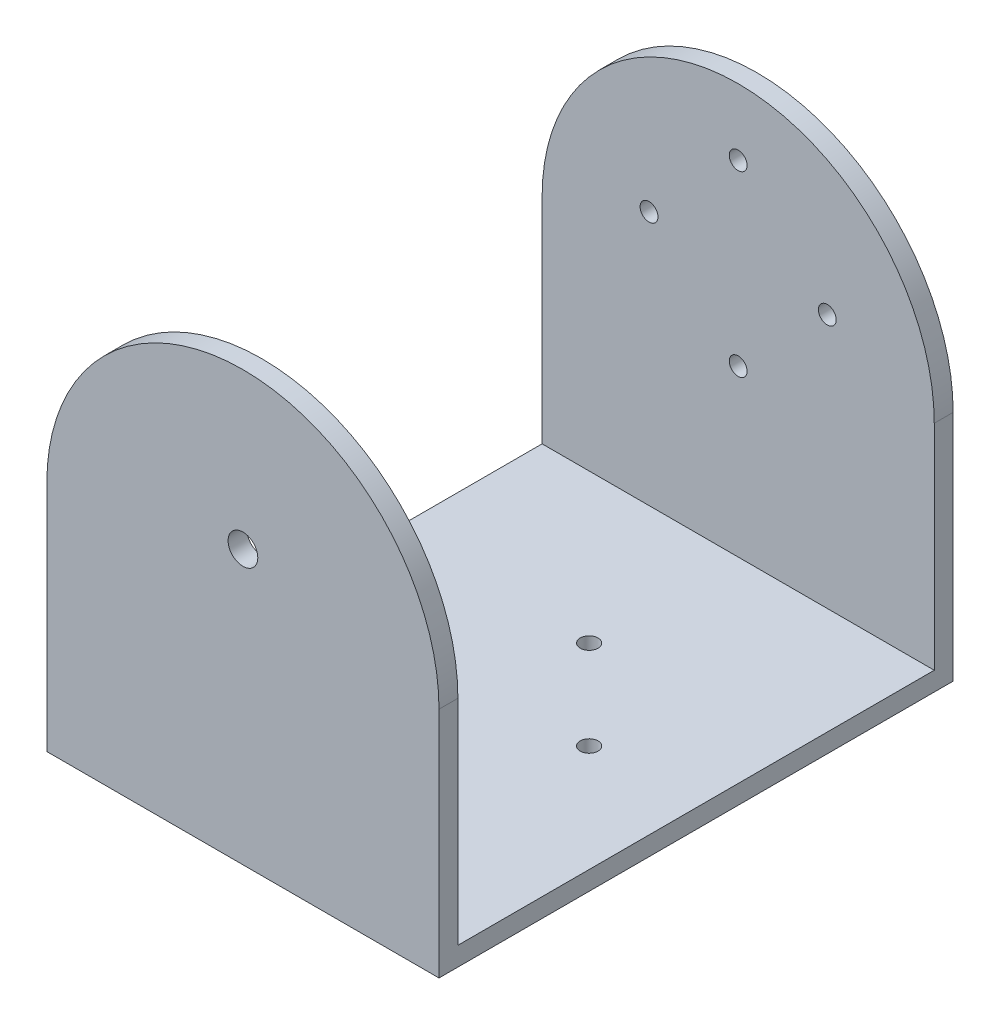
ISO-10303-21;
HEADER;
FILE_DESCRIPTION(('STEP AP214'),'2;1');
FILE_NAME('part.step','',(''),(''),'','','');
FILE_SCHEMA(('AUTOMOTIVE_DESIGN { 1 0 10303 214 1 1 1 1 }'));
ENDSEC;
DATA;
#1=APPLICATION_CONTEXT('core data for automotive mechanical design processes');
#2=APPLICATION_PROTOCOL_DEFINITION('international standard','automotive_design',2000,#1);
#3=PRODUCT_CONTEXT('',#1,'mechanical');
#4=PRODUCT('Part','Part','',(#3));
#5=PRODUCT_RELATED_PRODUCT_CATEGORY('part','',(#4));
#6=PRODUCT_DEFINITION_FORMATION('','',#4);
#7=PRODUCT_DEFINITION_CONTEXT('part definition',#1,'design');
#8=PRODUCT_DEFINITION('design','',#6,#7);
#9=PRODUCT_DEFINITION_SHAPE('','',#8);
#10=(LENGTH_UNIT() NAMED_UNIT(*) SI_UNIT(.MILLI.,.METRE.));
#11=(NAMED_UNIT(*) PLANE_ANGLE_UNIT() SI_UNIT($,.RADIAN.));
#12=(NAMED_UNIT(*) SI_UNIT($,.STERADIAN.) SOLID_ANGLE_UNIT());
#13=UNCERTAINTY_MEASURE_WITH_UNIT(LENGTH_MEASURE(1.E-05),#10,'distance_accuracy_value','');
#14=(GEOMETRIC_REPRESENTATION_CONTEXT(3) GLOBAL_UNCERTAINTY_ASSIGNED_CONTEXT((#13)) GLOBAL_UNIT_ASSIGNED_CONTEXT((#10,
#11,#12)) REPRESENTATION_CONTEXT('',''));
#15=CARTESIAN_POINT('',(0.,0.,0.));
#16=DIRECTION('',(0.,0.,1.));
#17=DIRECTION('',(1.,0.,0.));
#18=AXIS2_PLACEMENT_3D('',#15,#16,#17);
#19=CARTESIAN_POINT('',(0.,1.59,0.));
#20=DIRECTION('',(0.,1.,0.));
#21=DIRECTION('',(0.,0.,1.));
#22=AXIS2_PLACEMENT_3D('',#19,#20,#21);
#23=PLANE('',#22);
#24=CARTESIAN_POINT('',(7.5,1.59,0.));
#25=DIRECTION('',(0.,1.,0.));
#26=DIRECTION('',(0.,0.,1.));
#27=AXIS2_PLACEMENT_3D('',#24,#25,#26);
#28=CIRCLE('',#27,0.75);
#29=CARTESIAN_POINT('',(7.5,1.59,-0.75));
#30=VERTEX_POINT('',#29);
#31=EDGE_CURVE('E156',#30,#30,#28,.T.);
#32=ORIENTED_EDGE('',*,*,#31,.F.);
#33=EDGE_LOOP('',(#32));
#34=FACE_BOUND('',#33,.T.);
#35=CARTESIAN_POINT('',(0.,1.59,-7.5));
#36=DIRECTION('',(0.,1.,0.));
#37=DIRECTION('',(0.,0.,1.));
#38=AXIS2_PLACEMENT_3D('',#35,#36,#37);
#39=CIRCLE('',#38,0.75);
#40=CARTESIAN_POINT('',(0.,1.59,-8.25));
#41=VERTEX_POINT('',#40);
#42=EDGE_CURVE('E168',#41,#41,#39,.T.);
#43=ORIENTED_EDGE('',*,*,#42,.F.);
#44=EDGE_LOOP('',(#43));
#45=FACE_BOUND('',#44,.T.);
#46=CARTESIAN_POINT('',(0.,1.59,7.5));
#47=DIRECTION('',(0.,1.,0.));
#48=DIRECTION('',(0.,0.,1.));
#49=AXIS2_PLACEMENT_3D('',#46,#47,#48);
#50=CIRCLE('',#49,0.75);
#51=CARTESIAN_POINT('',(0.,1.59,6.75));
#52=VERTEX_POINT('',#51);
#53=EDGE_CURVE('E162',#52,#52,#50,.T.);
#54=ORIENTED_EDGE('',*,*,#53,.F.);
#55=EDGE_LOOP('',(#54));
#56=FACE_BOUND('',#55,.T.);
#57=CARTESIAN_POINT('',(-7.5,1.59,0.));
#58=DIRECTION('',(0.,1.,0.));
#59=DIRECTION('',(0.,0.,1.));
#60=AXIS2_PLACEMENT_3D('',#57,#58,#59);
#61=CIRCLE('',#60,0.75);
#62=CARTESIAN_POINT('',(-7.5,1.59,-0.75));
#63=VERTEX_POINT('',#62);
#64=EDGE_CURVE('E150',#63,#63,#61,.T.);
#65=ORIENTED_EDGE('',*,*,#64,.F.);
#66=EDGE_LOOP('',(#65));
#67=FACE_BOUND('',#66,.T.);
#68=DIRECTION('',(0.,0.,1.));
#69=VECTOR('',#68,1.);
#70=CARTESIAN_POINT('',(-16.5,1.59,-21.632));
#71=LINE('',#70,#69);
#72=CARTESIAN_POINT('',(-16.5,1.59,-20.042));
#73=VERTEX_POINT('',#72);
#74=CARTESIAN_POINT('',(-16.5,1.59,20.042));
#75=VERTEX_POINT('',#74);
#76=EDGE_CURVE('E54',#73,#75,#71,.T.);
#77=ORIENTED_EDGE('',*,*,#76,.T.);
#78=DIRECTION('',(-1.,0.,0.));
#79=VECTOR('',#78,1.);
#80=CARTESIAN_POINT('',(-16.5,1.59,20.042));
#81=LINE('',#80,#79);
#82=CARTESIAN_POINT('',(16.5,1.59,20.042));
#83=VERTEX_POINT('',#82);
#84=EDGE_CURVE('E49',#83,#75,#81,.T.);
#85=ORIENTED_EDGE('',*,*,#84,.F.);
#86=DIRECTION('',(0.,0.,-1.));
#87=VECTOR('',#86,1.);
#88=CARTESIAN_POINT('',(16.5,1.59,-21.632));
#89=LINE('',#88,#87);
#90=CARTESIAN_POINT('',(16.5,1.59,-20.042));
#91=VERTEX_POINT('',#90);
#92=EDGE_CURVE('E174',#83,#91,#89,.T.);
#93=ORIENTED_EDGE('',*,*,#92,.T.);
#94=DIRECTION('',(1.,0.,0.));
#95=VECTOR('',#94,1.);
#96=CARTESIAN_POINT('',(-16.5,1.59,-20.042));
#97=LINE('',#96,#95);
#98=EDGE_CURVE('E114',#73,#91,#97,.T.);
#99=ORIENTED_EDGE('',*,*,#98,.F.);
#100=EDGE_LOOP('',(#77,#85,#93,#99));
#101=FACE_BOUND('',#100,.T.);
#102=ADVANCED_FACE('F32',(#34,#45,#56,#67,#101),#23,.T.);
#103=CARTESIAN_POINT('',(0.,0.,0.));
#104=DIRECTION('',(0.,1.,0.));
#105=DIRECTION('',(0.,0.,1.));
#106=AXIS2_PLACEMENT_3D('',#103,#104,#105);
#107=PLANE('',#106);
#108=DIRECTION('',(0.,0.,-1.));
#109=VECTOR('',#108,1.);
#110=CARTESIAN_POINT('',(16.5,0.,-21.632));
#111=LINE('',#110,#109);
#112=CARTESIAN_POINT('',(16.5,0.,21.632));
#113=VERTEX_POINT('',#112);
#114=CARTESIAN_POINT('',(16.5,0.,-21.632));
#115=VERTEX_POINT('',#114);
#116=EDGE_CURVE('E171',#113,#115,#111,.T.);
#117=ORIENTED_EDGE('',*,*,#116,.F.);
#118=DIRECTION('',(1.,0.,0.));
#119=VECTOR('',#118,1.);
#120=CARTESIAN_POINT('',(-16.5,0.,21.632));
#121=LINE('',#120,#119);
#122=CARTESIAN_POINT('',(-16.5,0.,21.632));
#123=VERTEX_POINT('',#122);
#124=EDGE_CURVE('E176',#123,#113,#121,.T.);
#125=ORIENTED_EDGE('',*,*,#124,.F.);
#126=DIRECTION('',(0.,0.,1.));
#127=VECTOR('',#126,1.);
#128=CARTESIAN_POINT('',(-16.5,0.,-21.632));
#129=LINE('',#128,#127);
#130=CARTESIAN_POINT('',(-16.5,0.,-21.632));
#131=VERTEX_POINT('',#130);
#132=EDGE_CURVE('E182',#131,#123,#129,.T.);
#133=ORIENTED_EDGE('',*,*,#132,.F.);
#134=DIRECTION('',(-1.,0.,0.));
#135=VECTOR('',#134,1.);
#136=CARTESIAN_POINT('',(-16.5,0.,-21.632));
#137=LINE('',#136,#135);
#138=EDGE_CURVE('E180',#115,#131,#137,.T.);
#139=ORIENTED_EDGE('',*,*,#138,.F.);
#140=EDGE_LOOP('',(#117,#125,#133,#139));
#141=FACE_BOUND('',#140,.T.);
#142=CARTESIAN_POINT('',(0.,0.,-7.5));
#143=DIRECTION('',(0.,1.,0.));
#144=DIRECTION('',(0.,0.,1.));
#145=AXIS2_PLACEMENT_3D('',#142,#143,#144);
#146=CIRCLE('',#145,0.75);
#147=CARTESIAN_POINT('',(0.,0.,-8.25));
#148=VERTEX_POINT('',#147);
#149=EDGE_CURVE('E165',#148,#148,#146,.T.);
#150=ORIENTED_EDGE('',*,*,#149,.T.);
#151=EDGE_LOOP('',(#150));
#152=FACE_BOUND('',#151,.T.);
#153=CARTESIAN_POINT('',(0.,0.,7.5));
#154=DIRECTION('',(0.,1.,0.));
#155=DIRECTION('',(0.,0.,1.));
#156=AXIS2_PLACEMENT_3D('',#153,#154,#155);
#157=CIRCLE('',#156,0.75);
#158=CARTESIAN_POINT('',(0.,0.,6.75));
#159=VERTEX_POINT('',#158);
#160=EDGE_CURVE('E159',#159,#159,#157,.T.);
#161=ORIENTED_EDGE('',*,*,#160,.T.);
#162=EDGE_LOOP('',(#161));
#163=FACE_BOUND('',#162,.T.);
#164=CARTESIAN_POINT('',(7.5,0.,0.));
#165=DIRECTION('',(0.,1.,0.));
#166=DIRECTION('',(0.,0.,1.));
#167=AXIS2_PLACEMENT_3D('',#164,#165,#166);
#168=CIRCLE('',#167,0.75);
#169=CARTESIAN_POINT('',(7.5,0.,-0.75));
#170=VERTEX_POINT('',#169);
#171=EDGE_CURVE('E153',#170,#170,#168,.T.);
#172=ORIENTED_EDGE('',*,*,#171,.T.);
#173=EDGE_LOOP('',(#172));
#174=FACE_BOUND('',#173,.T.);
#175=CARTESIAN_POINT('',(-7.5,0.,0.));
#176=DIRECTION('',(0.,1.,0.));
#177=DIRECTION('',(0.,0.,1.));
#178=AXIS2_PLACEMENT_3D('',#175,#176,#177);
#179=CIRCLE('',#178,0.75);
#180=CARTESIAN_POINT('',(-7.5,0.,-0.75));
#181=VERTEX_POINT('',#180);
#182=EDGE_CURVE('E149',#181,#181,#179,.T.);
#183=ORIENTED_EDGE('',*,*,#182,.T.);
#184=EDGE_LOOP('',(#183));
#185=FACE_BOUND('',#184,.T.);
#186=ADVANCED_FACE('F238',(#141,#152,#163,#174,#185),#107,.F.);
#187=CARTESIAN_POINT('',(16.5,1.59,-21.632));
#188=DIRECTION('',(-1.,0.,0.));
#189=DIRECTION('',(0.,0.,1.));
#190=AXIS2_PLACEMENT_3D('',#187,#188,#189);
#191=PLANE('',#190);
#192=ORIENTED_EDGE('',*,*,#116,.T.);
#193=DIRECTION('',(0.,-1.,0.));
#194=VECTOR('',#193,1.);
#195=CARTESIAN_POINT('',(16.5,1.59,-21.632));
#196=LINE('',#195,#194);
#197=CARTESIAN_POINT('',(16.5,19.59,-21.632));
#198=VERTEX_POINT('',#197);
#199=EDGE_CURVE('E11',#198,#115,#196,.T.);
#200=ORIENTED_EDGE('',*,*,#199,.F.);
#201=DIRECTION('',(0.,0.,-1.));
#202=VECTOR('',#201,1.);
#203=CARTESIAN_POINT('',(16.5,19.59,-21.632));
#204=LINE('',#203,#202);
#205=CARTESIAN_POINT('',(16.5,19.59,-20.042));
#206=VERTEX_POINT('',#205);
#207=EDGE_CURVE('E97',#206,#198,#204,.T.);
#208=ORIENTED_EDGE('',*,*,#207,.F.);
#209=DIRECTION('',(0.,-1.,0.));
#210=VECTOR('',#209,1.);
#211=CARTESIAN_POINT('',(16.5,19.59,-20.042));
#212=LINE('',#211,#210);
#213=EDGE_CURVE('E100',#206,#91,#212,.T.);
#214=ORIENTED_EDGE('',*,*,#213,.T.);
#215=ORIENTED_EDGE('',*,*,#92,.F.);
#216=DIRECTION('',(0.,-1.,0.));
#217=VECTOR('',#216,1.);
#218=CARTESIAN_POINT('',(16.5,19.59,20.042));
#219=LINE('',#218,#217);
#220=CARTESIAN_POINT('',(16.5,19.59,20.042));
#221=VERTEX_POINT('',#220);
#222=EDGE_CURVE('E143',#221,#83,#219,.T.);
#223=ORIENTED_EDGE('',*,*,#222,.F.);
#224=DIRECTION('',(0.,0.,-1.));
#225=VECTOR('',#224,1.);
#226=CARTESIAN_POINT('',(16.5,19.59,21.632));
#227=LINE('',#226,#225);
#228=CARTESIAN_POINT('',(16.5,19.59,21.632));
#229=VERTEX_POINT('',#228);
#230=EDGE_CURVE('E136',#229,#221,#227,.T.);
#231=ORIENTED_EDGE('',*,*,#230,.F.);
#232=DIRECTION('',(0.,-1.,0.));
#233=VECTOR('',#232,1.);
#234=CARTESIAN_POINT('',(16.5,1.59,21.632));
#235=LINE('',#234,#233);
#236=EDGE_CURVE('E178',#229,#113,#235,.T.);
#237=ORIENTED_EDGE('',*,*,#236,.T.);
#238=EDGE_LOOP('',(#192,#200,#208,#214,#215,#223,#231,#237));
#239=FACE_BOUND('',#238,.T.);
#240=ADVANCED_FACE('F34',(#239),#191,.F.);
#241=CARTESIAN_POINT('',(-16.5,1.59,-21.632));
#242=DIRECTION('',(0.,0.,1.));
#243=DIRECTION('',(1.,0.,0.));
#244=AXIS2_PLACEMENT_3D('',#241,#242,#243);
#245=PLANE('',#244);
#246=CARTESIAN_POINT('',(0.,15.5,-21.632));
#247=DIRECTION('',(0.,0.,-1.));
#248=DIRECTION('',(-1.,0.,0.));
#249=AXIS2_PLACEMENT_3D('',#246,#247,#248);
#250=CIRCLE('',#249,0.750000000000001);
#251=CARTESIAN_POINT('',(-0.750000000000003,15.5,-21.632));
#252=VERTEX_POINT('',#251);
#253=EDGE_CURVE('E201',#252,#252,#250,.T.);
#254=ORIENTED_EDGE('',*,*,#253,.F.);
#255=EDGE_LOOP('',(#254));
#256=FACE_BOUND('',#255,.T.);
#257=CARTESIAN_POINT('',(-7.5,23.,-21.632));
#258=DIRECTION('',(0.,0.,-1.));
#259=DIRECTION('',(-1.,0.,0.));
#260=AXIS2_PLACEMENT_3D('',#257,#258,#259);
#261=CIRCLE('',#260,0.75);
#262=CARTESIAN_POINT('',(-8.25,23.,-21.632));
#263=VERTEX_POINT('',#262);
#264=EDGE_CURVE('E215',#263,#263,#261,.T.);
#265=ORIENTED_EDGE('',*,*,#264,.F.);
#266=EDGE_LOOP('',(#265));
#267=FACE_BOUND('',#266,.T.);
#268=CARTESIAN_POINT('',(7.5,23.,-21.632));
#269=DIRECTION('',(0.,0.,-1.));
#270=DIRECTION('',(-1.,0.,0.));
#271=AXIS2_PLACEMENT_3D('',#268,#269,#270);
#272=CIRCLE('',#271,0.75);
#273=CARTESIAN_POINT('',(6.75,23.,-21.632));
#274=VERTEX_POINT('',#273);
#275=EDGE_CURVE('E212',#274,#274,#272,.T.);
#276=ORIENTED_EDGE('',*,*,#275,.F.);
#277=EDGE_LOOP('',(#276));
#278=FACE_BOUND('',#277,.T.);
#279=CARTESIAN_POINT('',(0.,30.5,-21.632));
#280=DIRECTION('',(0.,0.,-1.));
#281=DIRECTION('',(-1.,0.,0.));
#282=AXIS2_PLACEMENT_3D('',#279,#280,#281);
#283=CIRCLE('',#282,0.750000000000001);
#284=CARTESIAN_POINT('',(-0.750000000000003,30.5,-21.632));
#285=VERTEX_POINT('',#284);
#286=EDGE_CURVE('E197',#285,#285,#283,.T.);
#287=ORIENTED_EDGE('',*,*,#286,.F.);
#288=EDGE_LOOP('',(#287));
#289=FACE_BOUND('',#288,.T.);
#290=ORIENTED_EDGE('',*,*,#138,.T.);
#291=DIRECTION('',(0.,-1.,0.));
#292=VECTOR('',#291,1.);
#293=CARTESIAN_POINT('',(-16.5,1.59,-21.632));
#294=LINE('',#293,#292);
#295=CARTESIAN_POINT('',(-16.5,19.59,-21.632));
#296=VERTEX_POINT('',#295);
#297=EDGE_CURVE('E41',#296,#131,#294,.T.);
#298=ORIENTED_EDGE('',*,*,#297,.F.);
#299=CARTESIAN_POINT('',(0.,19.59,-21.632));
#300=DIRECTION('',(0.,0.,-1.));
#301=DIRECTION('',(-1.,0.,0.));
#302=AXIS2_PLACEMENT_3D('',#299,#300,#301);
#303=CIRCLE('',#302,16.5);
#304=EDGE_CURVE('E120',#296,#198,#303,.T.);
#305=ORIENTED_EDGE('',*,*,#304,.T.);
#306=ORIENTED_EDGE('',*,*,#199,.T.);
#307=EDGE_LOOP('',(#290,#298,#305,#306));
#308=FACE_BOUND('',#307,.T.);
#309=ADVANCED_FACE('F224',(#256,#267,#278,#289,#308),#245,.F.);
#310=CARTESIAN_POINT('',(-16.5,1.59,-21.632));
#311=DIRECTION('',(1.,0.,0.));
#312=DIRECTION('',(0.,0.,-1.));
#313=AXIS2_PLACEMENT_3D('',#310,#311,#312);
#314=PLANE('',#313);
#315=ORIENTED_EDGE('',*,*,#132,.T.);
#316=DIRECTION('',(0.,-1.,0.));
#317=VECTOR('',#316,1.);
#318=CARTESIAN_POINT('',(-16.5,1.59,21.632));
#319=LINE('',#318,#317);
#320=CARTESIAN_POINT('',(-16.5,19.59,21.632));
#321=VERTEX_POINT('',#320);
#322=EDGE_CURVE('E187',#321,#123,#319,.T.);
#323=ORIENTED_EDGE('',*,*,#322,.F.);
#324=DIRECTION('',(0.,0.,1.));
#325=VECTOR('',#324,1.);
#326=CARTESIAN_POINT('',(-16.5,19.59,21.632));
#327=LINE('',#326,#325);
#328=CARTESIAN_POINT('',(-16.5,19.59,20.042));
#329=VERTEX_POINT('',#328);
#330=EDGE_CURVE('E133',#329,#321,#327,.T.);
#331=ORIENTED_EDGE('',*,*,#330,.F.);
#332=DIRECTION('',(0.,-1.,0.));
#333=VECTOR('',#332,1.);
#334=CARTESIAN_POINT('',(-16.5,19.59,20.042));
#335=LINE('',#334,#333);
#336=EDGE_CURVE('E139',#329,#75,#335,.T.);
#337=ORIENTED_EDGE('',*,*,#336,.T.);
#338=ORIENTED_EDGE('',*,*,#76,.F.);
#339=DIRECTION('',(0.,-1.,0.));
#340=VECTOR('',#339,1.);
#341=CARTESIAN_POINT('',(-16.5,19.59,-20.042));
#342=LINE('',#341,#340);
#343=CARTESIAN_POINT('',(-16.5,19.59,-20.042));
#344=VERTEX_POINT('',#343);
#345=EDGE_CURVE('E115',#344,#73,#342,.T.);
#346=ORIENTED_EDGE('',*,*,#345,.F.);
#347=DIRECTION('',(0.,0.,1.));
#348=VECTOR('',#347,1.);
#349=CARTESIAN_POINT('',(-16.5,19.59,-21.632));
#350=LINE('',#349,#348);
#351=EDGE_CURVE('E105',#296,#344,#350,.T.);
#352=ORIENTED_EDGE('',*,*,#351,.F.);
#353=ORIENTED_EDGE('',*,*,#297,.T.);
#354=EDGE_LOOP('',(#315,#323,#331,#337,#338,#346,#352,#353));
#355=FACE_BOUND('',#354,.T.);
#356=ADVANCED_FACE('F227',(#355),#314,.F.);
#357=CARTESIAN_POINT('',(-16.5,1.59,21.632));
#358=DIRECTION('',(0.,0.,-1.));
#359=DIRECTION('',(-1.,0.,0.));
#360=AXIS2_PLACEMENT_3D('',#357,#358,#359);
#361=PLANE('',#360);
#362=CARTESIAN_POINT('',(0.,23.,21.632));
#363=DIRECTION('',(0.,0.,1.));
#364=DIRECTION('',(1.,0.,0.));
#365=AXIS2_PLACEMENT_3D('',#362,#363,#364);
#366=CIRCLE('',#365,1.25);
#367=CARTESIAN_POINT('',(1.25,23.,21.632));
#368=VERTEX_POINT('',#367);
#369=EDGE_CURVE('E128',#368,#368,#366,.T.);
#370=ORIENTED_EDGE('',*,*,#369,.F.);
#371=EDGE_LOOP('',(#370));
#372=FACE_BOUND('',#371,.T.);
#373=ORIENTED_EDGE('',*,*,#124,.T.);
#374=ORIENTED_EDGE('',*,*,#236,.F.);
#375=CARTESIAN_POINT('',(0.,19.59,21.632));
#376=DIRECTION('',(0.,0.,1.));
#377=DIRECTION('',(1.,0.,0.));
#378=AXIS2_PLACEMENT_3D('',#375,#376,#377);
#379=CIRCLE('',#378,16.5);
#380=EDGE_CURVE('E119',#229,#321,#379,.T.);
#381=ORIENTED_EDGE('',*,*,#380,.T.);
#382=ORIENTED_EDGE('',*,*,#322,.T.);
#383=EDGE_LOOP('',(#373,#374,#381,#382));
#384=FACE_BOUND('',#383,.T.);
#385=ADVANCED_FACE('F241',(#372,#384),#361,.F.);
#386=CARTESIAN_POINT('',(0.,1.59,-7.5));
#387=DIRECTION('',(0.,-1.,0.));
#388=DIRECTION('',(0.,0.,-1.));
#389=AXIS2_PLACEMENT_3D('',#386,#387,#388);
#390=CYLINDRICAL_SURFACE('',#389,0.75);
#391=CARTESIAN_POINT('',(0.,1.59,-8.25));
#392=CARTESIAN_POINT('',(0.,1.5734375,-8.25));
#393=CARTESIAN_POINT('',(0.,1.556875,-8.25));
#394=CARTESIAN_POINT('',(0.,1.52375,-8.25));
#395=CARTESIAN_POINT('',(0.,1.5071875,-8.25));
#396=CARTESIAN_POINT('',(0.,1.4740625,-8.25));
#397=CARTESIAN_POINT('',(0.,1.4575,-8.25));
#398=CARTESIAN_POINT('',(0.,1.424375,-8.25));
#399=CARTESIAN_POINT('',(0.,1.4078125,-8.25));
#400=CARTESIAN_POINT('',(0.,1.3746875,-8.25));
#401=CARTESIAN_POINT('',(0.,1.358125,-8.25));
#402=CARTESIAN_POINT('',(0.,1.325,-8.25));
#403=CARTESIAN_POINT('',(0.,1.3084375,-8.25));
#404=CARTESIAN_POINT('',(0.,1.2753125,-8.25));
#405=CARTESIAN_POINT('',(0.,1.25875,-8.25));
#406=CARTESIAN_POINT('',(0.,1.225625,-8.25));
#407=CARTESIAN_POINT('',(0.,1.2090625,-8.25));
#408=CARTESIAN_POINT('',(0.,1.1759375,-8.25));
#409=CARTESIAN_POINT('',(0.,1.159375,-8.25));
#410=CARTESIAN_POINT('',(0.,1.12625,-8.25));
#411=CARTESIAN_POINT('',(0.,1.1096875,-8.25));
#412=CARTESIAN_POINT('',(0.,1.0765625,-8.25));
#413=CARTESIAN_POINT('',(0.,1.06,-8.25));
#414=CARTESIAN_POINT('',(0.,1.026875,-8.25));
#415=CARTESIAN_POINT('',(0.,1.0103125,-8.25));
#416=CARTESIAN_POINT('',(0.,0.9771875,-8.25));
#417=CARTESIAN_POINT('',(0.,0.960625,-8.25));
#418=CARTESIAN_POINT('',(0.,0.9275,-8.25));
#419=CARTESIAN_POINT('',(0.,0.9109375,-8.25));
#420=CARTESIAN_POINT('',(0.,0.8778125,-8.25));
#421=CARTESIAN_POINT('',(0.,0.86125,-8.25));
#422=CARTESIAN_POINT('',(0.,0.828125,-8.25));
#423=CARTESIAN_POINT('',(0.,0.8115625,-8.25));
#424=CARTESIAN_POINT('',(0.,0.7784375,-8.25));
#425=CARTESIAN_POINT('',(0.,0.761875,-8.25));
#426=CARTESIAN_POINT('',(0.,0.72875,-8.25));
#427=CARTESIAN_POINT('',(0.,0.7121875,-8.25));
#428=CARTESIAN_POINT('',(0.,0.6790625,-8.25));
#429=CARTESIAN_POINT('',(0.,0.6625,-8.25));
#430=CARTESIAN_POINT('',(0.,0.629375,-8.25));
#431=CARTESIAN_POINT('',(0.,0.6128125,-8.25));
#432=CARTESIAN_POINT('',(0.,0.5796875,-8.25));
#433=CARTESIAN_POINT('',(0.,0.563125,-8.25));
#434=CARTESIAN_POINT('',(0.,0.53,-8.25));
#435=CARTESIAN_POINT('',(0.,0.5134375,-8.25));
#436=CARTESIAN_POINT('',(0.,0.4803125,-8.25));
#437=CARTESIAN_POINT('',(0.,0.46375,-8.25));
#438=CARTESIAN_POINT('',(0.,0.430625,-8.25));
#439=CARTESIAN_POINT('',(0.,0.4140625,-8.25));
#440=CARTESIAN_POINT('',(0.,0.3809375,-8.25));
#441=CARTESIAN_POINT('',(0.,0.364375,-8.25));
#442=CARTESIAN_POINT('',(0.,0.33125,-8.25));
#443=CARTESIAN_POINT('',(0.,0.3146875,-8.25));
#444=CARTESIAN_POINT('',(0.,0.2815625,-8.25));
#445=CARTESIAN_POINT('',(0.,0.265,-8.25));
#446=CARTESIAN_POINT('',(0.,0.231875,-8.25));
#447=CARTESIAN_POINT('',(0.,0.2153125,-8.25));
#448=CARTESIAN_POINT('',(0.,0.1821875,-8.25));
#449=CARTESIAN_POINT('',(0.,0.165625,-8.25));
#450=CARTESIAN_POINT('',(0.,0.1325,-8.25));
#451=CARTESIAN_POINT('',(0.,0.1159375,-8.25));
#452=CARTESIAN_POINT('',(0.,0.0828125000000001,-8.25));
#453=CARTESIAN_POINT('',(0.,0.06625,-8.25));
#454=CARTESIAN_POINT('',(0.,0.033125,-8.25));
#455=CARTESIAN_POINT('',(0.,0.0165625,-8.25));
#456=CARTESIAN_POINT('',(0.,0.,-8.25));
#457=B_SPLINE_CURVE_WITH_KNOTS('',3,(#391,#392,#393,#394,#395,#396,#397,#398,#399,#400,#401,
#402,#403,#404,#405,#406,#407,#408,#409,#410,#411,#412,#413,#414,#415,#416,#417,#418,#419,#420,
#421,#422,#423,#424,#425,#426,#427,#428,#429,#430,#431,#432,#433,#434,#435,#436,#437,#438,#439,
#440,#441,#442,#443,#444,#445,#446,#447,#448,#449,#450,#451,#452,#453,#454,#455,#456),
.UNSPECIFIED.,.F.,.F.,(4,2,2,2,2,2,2,2,2,2,2,2,2,2,2,2,2,2,2,2,2,2,2,2,2,2,2,2,2,2,2,2,4),(0.,
0.0496874999999998,0.0993749999999999,0.1490625,0.19875,0.2484375,0.298125,0.3478125,0.3975,
0.4471875,0.496875,0.5465625,0.59625,0.6459375,0.695625,0.7453125,0.795,0.8446875,0.894375,
0.9440625,0.99375,1.0434375,1.093125,1.1428125,1.1925,1.2421875,1.291875,1.3415625,1.39125,
1.4409375,1.490625,1.5403125,1.59),.UNSPECIFIED.);
#458=EDGE_CURVE('BSEAM270',#41,#148,#457,.T.);
#459=ORIENTED_EDGE('',*,*,#42,.T.);
#460=ORIENTED_EDGE('',*,*,#149,.F.);
#461=ORIENTED_EDGE('',*,*,#458,.T.);
#462=ORIENTED_EDGE('',*,*,#458,.F.);
#463=EDGE_LOOP('',(#459,#461,#460,#462));
#464=FACE_BOUND('',#463,.T.);
#465=ADVANCED_FACE('F270',(#464),#390,.F.);
#466=CARTESIAN_POINT('',(0.,1.59,7.5));
#467=DIRECTION('',(0.,-1.,0.));
#468=DIRECTION('',(0.,0.,-1.));
#469=AXIS2_PLACEMENT_3D('',#466,#467,#468);
#470=CYLINDRICAL_SURFACE('',#469,0.75);
#471=CARTESIAN_POINT('',(0.,1.59,6.75));
#472=CARTESIAN_POINT('',(0.,1.5734375,6.75));
#473=CARTESIAN_POINT('',(0.,1.556875,6.75));
#474=CARTESIAN_POINT('',(0.,1.52375,6.75));
#475=CARTESIAN_POINT('',(0.,1.5071875,6.75));
#476=CARTESIAN_POINT('',(0.,1.4740625,6.75));
#477=CARTESIAN_POINT('',(0.,1.4575,6.75));
#478=CARTESIAN_POINT('',(0.,1.424375,6.75));
#479=CARTESIAN_POINT('',(0.,1.4078125,6.75));
#480=CARTESIAN_POINT('',(0.,1.3746875,6.75));
#481=CARTESIAN_POINT('',(0.,1.358125,6.75));
#482=CARTESIAN_POINT('',(0.,1.325,6.75));
#483=CARTESIAN_POINT('',(0.,1.3084375,6.75));
#484=CARTESIAN_POINT('',(0.,1.2753125,6.75));
#485=CARTESIAN_POINT('',(0.,1.25875,6.75));
#486=CARTESIAN_POINT('',(0.,1.225625,6.75));
#487=CARTESIAN_POINT('',(0.,1.2090625,6.75));
#488=CARTESIAN_POINT('',(0.,1.1759375,6.75));
#489=CARTESIAN_POINT('',(0.,1.159375,6.75));
#490=CARTESIAN_POINT('',(0.,1.12625,6.75));
#491=CARTESIAN_POINT('',(0.,1.1096875,6.75));
#492=CARTESIAN_POINT('',(0.,1.0765625,6.75));
#493=CARTESIAN_POINT('',(0.,1.06,6.75));
#494=CARTESIAN_POINT('',(0.,1.026875,6.75));
#495=CARTESIAN_POINT('',(0.,1.0103125,6.75));
#496=CARTESIAN_POINT('',(0.,0.9771875,6.75));
#497=CARTESIAN_POINT('',(0.,0.960625,6.75));
#498=CARTESIAN_POINT('',(0.,0.9275,6.75));
#499=CARTESIAN_POINT('',(0.,0.9109375,6.75));
#500=CARTESIAN_POINT('',(0.,0.8778125,6.75));
#501=CARTESIAN_POINT('',(0.,0.86125,6.75));
#502=CARTESIAN_POINT('',(0.,0.828125,6.75));
#503=CARTESIAN_POINT('',(0.,0.8115625,6.75));
#504=CARTESIAN_POINT('',(0.,0.7784375,6.75));
#505=CARTESIAN_POINT('',(0.,0.761875,6.75));
#506=CARTESIAN_POINT('',(0.,0.72875,6.75));
#507=CARTESIAN_POINT('',(0.,0.7121875,6.75));
#508=CARTESIAN_POINT('',(0.,0.6790625,6.75));
#509=CARTESIAN_POINT('',(0.,0.6625,6.75));
#510=CARTESIAN_POINT('',(0.,0.629375,6.75));
#511=CARTESIAN_POINT('',(0.,0.6128125,6.75));
#512=CARTESIAN_POINT('',(0.,0.5796875,6.75));
#513=CARTESIAN_POINT('',(0.,0.563125,6.75));
#514=CARTESIAN_POINT('',(0.,0.53,6.75));
#515=CARTESIAN_POINT('',(0.,0.5134375,6.75));
#516=CARTESIAN_POINT('',(0.,0.4803125,6.75));
#517=CARTESIAN_POINT('',(0.,0.46375,6.75));
#518=CARTESIAN_POINT('',(0.,0.430625,6.75));
#519=CARTESIAN_POINT('',(0.,0.4140625,6.75));
#520=CARTESIAN_POINT('',(0.,0.3809375,6.75));
#521=CARTESIAN_POINT('',(0.,0.364375,6.75));
#522=CARTESIAN_POINT('',(0.,0.33125,6.75));
#523=CARTESIAN_POINT('',(0.,0.3146875,6.75));
#524=CARTESIAN_POINT('',(0.,0.2815625,6.75));
#525=CARTESIAN_POINT('',(0.,0.265,6.75));
#526=CARTESIAN_POINT('',(0.,0.231875,6.75));
#527=CARTESIAN_POINT('',(0.,0.2153125,6.75));
#528=CARTESIAN_POINT('',(0.,0.1821875,6.75));
#529=CARTESIAN_POINT('',(0.,0.165625,6.75));
#530=CARTESIAN_POINT('',(0.,0.1325,6.75));
#531=CARTESIAN_POINT('',(0.,0.1159375,6.75));
#532=CARTESIAN_POINT('',(0.,0.0828125000000001,6.75));
#533=CARTESIAN_POINT('',(0.,0.06625,6.75));
#534=CARTESIAN_POINT('',(0.,0.033125,6.75));
#535=CARTESIAN_POINT('',(0.,0.0165625,6.75));
#536=CARTESIAN_POINT('',(0.,0.,6.75));
#537=B_SPLINE_CURVE_WITH_KNOTS('',3,(#471,#472,#473,#474,#475,#476,#477,#478,#479,#480,#481,
#482,#483,#484,#485,#486,#487,#488,#489,#490,#491,#492,#493,#494,#495,#496,#497,#498,#499,#500,
#501,#502,#503,#504,#505,#506,#507,#508,#509,#510,#511,#512,#513,#514,#515,#516,#517,#518,#519,
#520,#521,#522,#523,#524,#525,#526,#527,#528,#529,#530,#531,#532,#533,#534,#535,#536),
.UNSPECIFIED.,.F.,.F.,(4,2,2,2,2,2,2,2,2,2,2,2,2,2,2,2,2,2,2,2,2,2,2,2,2,2,2,2,2,2,2,2,4),(0.,
0.0496874999999998,0.0993749999999999,0.1490625,0.19875,0.2484375,0.298125,0.3478125,0.3975,
0.4471875,0.496875,0.5465625,0.59625,0.6459375,0.695625,0.7453125,0.795,0.8446875,0.894375,
0.9440625,0.99375,1.0434375,1.093125,1.1428125,1.1925,1.2421875,1.291875,1.3415625,1.39125,
1.4409375,1.490625,1.5403125,1.59),.UNSPECIFIED.);
#538=EDGE_CURVE('BSEAM294',#52,#159,#537,.T.);
#539=ORIENTED_EDGE('',*,*,#53,.T.);
#540=ORIENTED_EDGE('',*,*,#160,.F.);
#541=ORIENTED_EDGE('',*,*,#538,.T.);
#542=ORIENTED_EDGE('',*,*,#538,.F.);
#543=EDGE_LOOP('',(#539,#541,#540,#542));
#544=FACE_BOUND('',#543,.T.);
#545=ADVANCED_FACE('F294',(#544),#470,.F.);
#546=CARTESIAN_POINT('',(7.5,1.59,0.));
#547=DIRECTION('',(0.,-1.,0.));
#548=DIRECTION('',(0.,0.,-1.));
#549=AXIS2_PLACEMENT_3D('',#546,#547,#548);
#550=CYLINDRICAL_SURFACE('',#549,0.75);
#551=CARTESIAN_POINT('',(7.5,1.59,-0.75));
#552=CARTESIAN_POINT('',(7.5,1.5734375,-0.75));
#553=CARTESIAN_POINT('',(7.5,1.556875,-0.75));
#554=CARTESIAN_POINT('',(7.5,1.52375,-0.75));
#555=CARTESIAN_POINT('',(7.5,1.5071875,-0.75));
#556=CARTESIAN_POINT('',(7.5,1.4740625,-0.75));
#557=CARTESIAN_POINT('',(7.5,1.4575,-0.75));
#558=CARTESIAN_POINT('',(7.5,1.424375,-0.75));
#559=CARTESIAN_POINT('',(7.5,1.4078125,-0.75));
#560=CARTESIAN_POINT('',(7.5,1.3746875,-0.75));
#561=CARTESIAN_POINT('',(7.5,1.358125,-0.75));
#562=CARTESIAN_POINT('',(7.5,1.325,-0.75));
#563=CARTESIAN_POINT('',(7.5,1.3084375,-0.75));
#564=CARTESIAN_POINT('',(7.5,1.2753125,-0.75));
#565=CARTESIAN_POINT('',(7.5,1.25875,-0.75));
#566=CARTESIAN_POINT('',(7.5,1.225625,-0.75));
#567=CARTESIAN_POINT('',(7.5,1.2090625,-0.75));
#568=CARTESIAN_POINT('',(7.5,1.1759375,-0.75));
#569=CARTESIAN_POINT('',(7.5,1.159375,-0.75));
#570=CARTESIAN_POINT('',(7.5,1.12625,-0.75));
#571=CARTESIAN_POINT('',(7.5,1.1096875,-0.75));
#572=CARTESIAN_POINT('',(7.5,1.0765625,-0.75));
#573=CARTESIAN_POINT('',(7.5,1.06,-0.75));
#574=CARTESIAN_POINT('',(7.5,1.026875,-0.75));
#575=CARTESIAN_POINT('',(7.5,1.0103125,-0.75));
#576=CARTESIAN_POINT('',(7.5,0.9771875,-0.75));
#577=CARTESIAN_POINT('',(7.5,0.960625,-0.75));
#578=CARTESIAN_POINT('',(7.5,0.9275,-0.75));
#579=CARTESIAN_POINT('',(7.5,0.9109375,-0.75));
#580=CARTESIAN_POINT('',(7.5,0.8778125,-0.75));
#581=CARTESIAN_POINT('',(7.5,0.86125,-0.75));
#582=CARTESIAN_POINT('',(7.5,0.828125,-0.75));
#583=CARTESIAN_POINT('',(7.5,0.8115625,-0.75));
#584=CARTESIAN_POINT('',(7.5,0.7784375,-0.75));
#585=CARTESIAN_POINT('',(7.5,0.761875,-0.75));
#586=CARTESIAN_POINT('',(7.5,0.72875,-0.75));
#587=CARTESIAN_POINT('',(7.5,0.7121875,-0.75));
#588=CARTESIAN_POINT('',(7.5,0.6790625,-0.75));
#589=CARTESIAN_POINT('',(7.5,0.6625,-0.75));
#590=CARTESIAN_POINT('',(7.5,0.629375,-0.75));
#591=CARTESIAN_POINT('',(7.5,0.6128125,-0.75));
#592=CARTESIAN_POINT('',(7.5,0.5796875,-0.75));
#593=CARTESIAN_POINT('',(7.5,0.563125,-0.75));
#594=CARTESIAN_POINT('',(7.5,0.53,-0.75));
#595=CARTESIAN_POINT('',(7.5,0.5134375,-0.75));
#596=CARTESIAN_POINT('',(7.5,0.4803125,-0.75));
#597=CARTESIAN_POINT('',(7.5,0.46375,-0.75));
#598=CARTESIAN_POINT('',(7.5,0.430625,-0.75));
#599=CARTESIAN_POINT('',(7.5,0.4140625,-0.75));
#600=CARTESIAN_POINT('',(7.5,0.3809375,-0.75));
#601=CARTESIAN_POINT('',(7.5,0.364375,-0.75));
#602=CARTESIAN_POINT('',(7.5,0.33125,-0.75));
#603=CARTESIAN_POINT('',(7.5,0.3146875,-0.75));
#604=CARTESIAN_POINT('',(7.5,0.2815625,-0.75));
#605=CARTESIAN_POINT('',(7.5,0.265,-0.75));
#606=CARTESIAN_POINT('',(7.5,0.231875,-0.75));
#607=CARTESIAN_POINT('',(7.5,0.2153125,-0.75));
#608=CARTESIAN_POINT('',(7.5,0.1821875,-0.75));
#609=CARTESIAN_POINT('',(7.5,0.165625,-0.75));
#610=CARTESIAN_POINT('',(7.5,0.1325,-0.75));
#611=CARTESIAN_POINT('',(7.5,0.1159375,-0.75));
#612=CARTESIAN_POINT('',(7.5,0.0828125000000001,-0.75));
#613=CARTESIAN_POINT('',(7.5,0.06625,-0.75));
#614=CARTESIAN_POINT('',(7.5,0.033125,-0.75));
#615=CARTESIAN_POINT('',(7.5,0.0165625,-0.75));
#616=CARTESIAN_POINT('',(7.5,0.,-0.75));
#617=B_SPLINE_CURVE_WITH_KNOTS('',3,(#551,#552,#553,#554,#555,#556,#557,#558,#559,#560,#561,
#562,#563,#564,#565,#566,#567,#568,#569,#570,#571,#572,#573,#574,#575,#576,#577,#578,#579,#580,
#581,#582,#583,#584,#585,#586,#587,#588,#589,#590,#591,#592,#593,#594,#595,#596,#597,#598,#599,
#600,#601,#602,#603,#604,#605,#606,#607,#608,#609,#610,#611,#612,#613,#614,#615,#616),
.UNSPECIFIED.,.F.,.F.,(4,2,2,2,2,2,2,2,2,2,2,2,2,2,2,2,2,2,2,2,2,2,2,2,2,2,2,2,2,2,2,2,4),(0.,
0.0496874999999998,0.0993749999999999,0.1490625,0.19875,0.2484375,0.298125,0.3478125,0.3975,
0.4471875,0.496875,0.5465625,0.59625,0.6459375,0.695625,0.7453125,0.795,0.8446875,0.894375,
0.9440625,0.99375,1.0434375,1.093125,1.1428125,1.1925,1.2421875,1.291875,1.3415625,1.39125,
1.4409375,1.490625,1.5403125,1.59),.UNSPECIFIED.);
#618=EDGE_CURVE('BSEAM302',#30,#170,#617,.T.);
#619=ORIENTED_EDGE('',*,*,#31,.T.);
#620=ORIENTED_EDGE('',*,*,#171,.F.);
#621=ORIENTED_EDGE('',*,*,#618,.T.);
#622=ORIENTED_EDGE('',*,*,#618,.F.);
#623=EDGE_LOOP('',(#619,#621,#620,#622));
#624=FACE_BOUND('',#623,.T.);
#625=ADVANCED_FACE('F302',(#624),#550,.F.);
#626=CARTESIAN_POINT('',(-7.5,1.59,0.));
#627=DIRECTION('',(0.,-1.,0.));
#628=DIRECTION('',(0.,0.,-1.));
#629=AXIS2_PLACEMENT_3D('',#626,#627,#628);
#630=CYLINDRICAL_SURFACE('',#629,0.75);
#631=CARTESIAN_POINT('',(-7.5,1.59,-0.75));
#632=CARTESIAN_POINT('',(-7.5,1.5734375,-0.75));
#633=CARTESIAN_POINT('',(-7.5,1.556875,-0.75));
#634=CARTESIAN_POINT('',(-7.5,1.52375,-0.75));
#635=CARTESIAN_POINT('',(-7.5,1.5071875,-0.75));
#636=CARTESIAN_POINT('',(-7.5,1.4740625,-0.75));
#637=CARTESIAN_POINT('',(-7.5,1.4575,-0.75));
#638=CARTESIAN_POINT('',(-7.5,1.424375,-0.75));
#639=CARTESIAN_POINT('',(-7.5,1.4078125,-0.75));
#640=CARTESIAN_POINT('',(-7.5,1.3746875,-0.75));
#641=CARTESIAN_POINT('',(-7.5,1.358125,-0.75));
#642=CARTESIAN_POINT('',(-7.5,1.325,-0.75));
#643=CARTESIAN_POINT('',(-7.5,1.3084375,-0.75));
#644=CARTESIAN_POINT('',(-7.5,1.2753125,-0.75));
#645=CARTESIAN_POINT('',(-7.5,1.25875,-0.75));
#646=CARTESIAN_POINT('',(-7.5,1.225625,-0.75));
#647=CARTESIAN_POINT('',(-7.5,1.2090625,-0.75));
#648=CARTESIAN_POINT('',(-7.5,1.1759375,-0.75));
#649=CARTESIAN_POINT('',(-7.5,1.159375,-0.75));
#650=CARTESIAN_POINT('',(-7.5,1.12625,-0.75));
#651=CARTESIAN_POINT('',(-7.5,1.1096875,-0.75));
#652=CARTESIAN_POINT('',(-7.5,1.0765625,-0.75));
#653=CARTESIAN_POINT('',(-7.5,1.06,-0.75));
#654=CARTESIAN_POINT('',(-7.5,1.026875,-0.75));
#655=CARTESIAN_POINT('',(-7.5,1.0103125,-0.75));
#656=CARTESIAN_POINT('',(-7.5,0.9771875,-0.75));
#657=CARTESIAN_POINT('',(-7.5,0.960625,-0.75));
#658=CARTESIAN_POINT('',(-7.5,0.9275,-0.75));
#659=CARTESIAN_POINT('',(-7.5,0.9109375,-0.75));
#660=CARTESIAN_POINT('',(-7.5,0.8778125,-0.75));
#661=CARTESIAN_POINT('',(-7.5,0.86125,-0.75));
#662=CARTESIAN_POINT('',(-7.5,0.828125,-0.75));
#663=CARTESIAN_POINT('',(-7.5,0.8115625,-0.75));
#664=CARTESIAN_POINT('',(-7.5,0.7784375,-0.75));
#665=CARTESIAN_POINT('',(-7.5,0.761875,-0.75));
#666=CARTESIAN_POINT('',(-7.5,0.72875,-0.75));
#667=CARTESIAN_POINT('',(-7.5,0.7121875,-0.75));
#668=CARTESIAN_POINT('',(-7.5,0.6790625,-0.75));
#669=CARTESIAN_POINT('',(-7.5,0.6625,-0.75));
#670=CARTESIAN_POINT('',(-7.5,0.629375,-0.75));
#671=CARTESIAN_POINT('',(-7.5,0.6128125,-0.75));
#672=CARTESIAN_POINT('',(-7.5,0.5796875,-0.75));
#673=CARTESIAN_POINT('',(-7.5,0.563125,-0.75));
#674=CARTESIAN_POINT('',(-7.5,0.53,-0.75));
#675=CARTESIAN_POINT('',(-7.5,0.5134375,-0.75));
#676=CARTESIAN_POINT('',(-7.5,0.4803125,-0.75));
#677=CARTESIAN_POINT('',(-7.5,0.46375,-0.75));
#678=CARTESIAN_POINT('',(-7.5,0.430625,-0.75));
#679=CARTESIAN_POINT('',(-7.5,0.4140625,-0.75));
#680=CARTESIAN_POINT('',(-7.5,0.3809375,-0.75));
#681=CARTESIAN_POINT('',(-7.5,0.364375,-0.75));
#682=CARTESIAN_POINT('',(-7.5,0.33125,-0.75));
#683=CARTESIAN_POINT('',(-7.5,0.3146875,-0.75));
#684=CARTESIAN_POINT('',(-7.5,0.2815625,-0.75));
#685=CARTESIAN_POINT('',(-7.5,0.265,-0.75));
#686=CARTESIAN_POINT('',(-7.5,0.231875,-0.75));
#687=CARTESIAN_POINT('',(-7.5,0.2153125,-0.75));
#688=CARTESIAN_POINT('',(-7.5,0.1821875,-0.75));
#689=CARTESIAN_POINT('',(-7.5,0.165625,-0.75));
#690=CARTESIAN_POINT('',(-7.5,0.1325,-0.75));
#691=CARTESIAN_POINT('',(-7.5,0.1159375,-0.75));
#692=CARTESIAN_POINT('',(-7.5,0.0828125000000001,-0.75));
#693=CARTESIAN_POINT('',(-7.5,0.06625,-0.75));
#694=CARTESIAN_POINT('',(-7.5,0.033125,-0.75));
#695=CARTESIAN_POINT('',(-7.5,0.0165625,-0.75));
#696=CARTESIAN_POINT('',(-7.5,0.,-0.75));
#697=B_SPLINE_CURVE_WITH_KNOTS('',3,(#631,#632,#633,#634,#635,#636,#637,#638,#639,#640,#641,
#642,#643,#644,#645,#646,#647,#648,#649,#650,#651,#652,#653,#654,#655,#656,#657,#658,#659,#660,
#661,#662,#663,#664,#665,#666,#667,#668,#669,#670,#671,#672,#673,#674,#675,#676,#677,#678,#679,
#680,#681,#682,#683,#684,#685,#686,#687,#688,#689,#690,#691,#692,#693,#694,#695,#696),
.UNSPECIFIED.,.F.,.F.,(4,2,2,2,2,2,2,2,2,2,2,2,2,2,2,2,2,2,2,2,2,2,2,2,2,2,2,2,2,2,2,2,4),(0.,
0.0496874999999998,0.0993749999999999,0.1490625,0.19875,0.2484375,0.298125,0.3478125,0.3975,
0.4471875,0.496875,0.5465625,0.59625,0.6459375,0.695625,0.7453125,0.795,0.8446875,0.894375,
0.9440625,0.99375,1.0434375,1.093125,1.1428125,1.1925,1.2421875,1.291875,1.3415625,1.39125,
1.4409375,1.490625,1.5403125,1.59),.UNSPECIFIED.);
#698=EDGE_CURVE('BSEAM258',#63,#181,#697,.T.);
#699=ORIENTED_EDGE('',*,*,#64,.T.);
#700=ORIENTED_EDGE('',*,*,#182,.F.);
#701=ORIENTED_EDGE('',*,*,#698,.T.);
#702=ORIENTED_EDGE('',*,*,#698,.F.);
#703=EDGE_LOOP('',(#699,#701,#700,#702));
#704=FACE_BOUND('',#703,.T.);
#705=ADVANCED_FACE('F258',(#704),#630,.F.);
#706=CARTESIAN_POINT('',(-16.5,19.59,-20.042));
#707=DIRECTION('',(0.,0.,-1.));
#708=DIRECTION('',(-1.,0.,0.));
#709=AXIS2_PLACEMENT_3D('',#706,#707,#708);
#710=PLANE('',#709);
#711=CARTESIAN_POINT('',(0.,15.5,-20.042));
#712=DIRECTION('',(0.,0.,-1.));
#713=DIRECTION('',(-1.,0.,0.));
#714=AXIS2_PLACEMENT_3D('',#711,#712,#713);
#715=CIRCLE('',#714,0.750000000000001);
#716=CARTESIAN_POINT('',(-0.750000000000003,15.5,-20.042));
#717=VERTEX_POINT('',#716);
#718=EDGE_CURVE('E36',#717,#717,#715,.T.);
#719=ORIENTED_EDGE('',*,*,#718,.T.);
#720=EDGE_LOOP('',(#719));
#721=FACE_BOUND('',#720,.T.);
#722=CARTESIAN_POINT('',(-7.5,23.,-20.042));
#723=DIRECTION('',(0.,0.,-1.));
#724=DIRECTION('',(-1.,0.,0.));
#725=AXIS2_PLACEMENT_3D('',#722,#723,#724);
#726=CIRCLE('',#725,0.75);
#727=CARTESIAN_POINT('',(-8.25,23.,-20.042));
#728=VERTEX_POINT('',#727);
#729=EDGE_CURVE('E200',#728,#728,#726,.T.);
#730=ORIENTED_EDGE('',*,*,#729,.T.);
#731=EDGE_LOOP('',(#730));
#732=FACE_BOUND('',#731,.T.);
#733=CARTESIAN_POINT('',(7.5,23.,-20.042));
#734=DIRECTION('',(0.,0.,-1.));
#735=DIRECTION('',(-1.,0.,0.));
#736=AXIS2_PLACEMENT_3D('',#733,#734,#735);
#737=CIRCLE('',#736,0.75);
#738=CARTESIAN_POINT('',(6.75,23.,-20.042));
#739=VERTEX_POINT('',#738);
#740=EDGE_CURVE('E198',#739,#739,#737,.T.);
#741=ORIENTED_EDGE('',*,*,#740,.T.);
#742=EDGE_LOOP('',(#741));
#743=FACE_BOUND('',#742,.T.);
#744=CARTESIAN_POINT('',(0.,30.5,-20.042));
#745=DIRECTION('',(0.,0.,-1.));
#746=DIRECTION('',(-1.,0.,0.));
#747=AXIS2_PLACEMENT_3D('',#744,#745,#746);
#748=CIRCLE('',#747,0.750000000000001);
#749=CARTESIAN_POINT('',(-0.750000000000003,30.5,-20.042));
#750=VERTEX_POINT('',#749);
#751=EDGE_CURVE('E194',#750,#750,#748,.T.);
#752=ORIENTED_EDGE('',*,*,#751,.T.);
#753=EDGE_LOOP('',(#752));
#754=FACE_BOUND('',#753,.T.);
#755=ORIENTED_EDGE('',*,*,#98,.T.);
#756=ORIENTED_EDGE('',*,*,#213,.F.);
#757=CARTESIAN_POINT('',(0.,19.59,-20.042));
#758=DIRECTION('',(0.,0.,-1.));
#759=DIRECTION('',(-1.,0.,0.));
#760=AXIS2_PLACEMENT_3D('',#757,#758,#759);
#761=CIRCLE('',#760,16.5);
#762=EDGE_CURVE('E112',#206,#344,#761,.F.);
#763=ORIENTED_EDGE('',*,*,#762,.T.);
#764=ORIENTED_EDGE('',*,*,#345,.T.);
#765=EDGE_LOOP('',(#755,#756,#763,#764));
#766=FACE_BOUND('',#765,.T.);
#767=ADVANCED_FACE('F110',(#721,#732,#743,#754,#766),#710,.F.);
#768=CARTESIAN_POINT('',(-16.5,19.59,20.042));
#769=DIRECTION('',(0.,0.,1.));
#770=DIRECTION('',(1.,0.,0.));
#771=AXIS2_PLACEMENT_3D('',#768,#769,#770);
#772=PLANE('',#771);
#773=CARTESIAN_POINT('',(0.,23.,20.042));
#774=DIRECTION('',(0.,0.,1.));
#775=DIRECTION('',(1.,0.,0.));
#776=AXIS2_PLACEMENT_3D('',#773,#774,#775);
#777=CIRCLE('',#776,1.25);
#778=CARTESIAN_POINT('',(1.25,23.,20.042));
#779=VERTEX_POINT('',#778);
#780=EDGE_CURVE('E125',#779,#779,#777,.T.);
#781=ORIENTED_EDGE('',*,*,#780,.T.);
#782=EDGE_LOOP('',(#781));
#783=FACE_BOUND('',#782,.T.);
#784=ORIENTED_EDGE('',*,*,#84,.T.);
#785=ORIENTED_EDGE('',*,*,#336,.F.);
#786=CARTESIAN_POINT('',(0.,19.59,20.042));
#787=DIRECTION('',(0.,0.,1.));
#788=DIRECTION('',(1.,0.,0.));
#789=AXIS2_PLACEMENT_3D('',#786,#787,#788);
#790=CIRCLE('',#789,16.5);
#791=EDGE_CURVE('E123',#329,#221,#790,.F.);
#792=ORIENTED_EDGE('',*,*,#791,.T.);
#793=ORIENTED_EDGE('',*,*,#222,.T.);
#794=EDGE_LOOP('',(#784,#785,#792,#793));
#795=FACE_BOUND('',#794,.T.);
#796=ADVANCED_FACE('F249',(#783,#795),#772,.F.);
#797=CARTESIAN_POINT('',(0.,19.59,-16.8531216287465));
#798=DIRECTION('',(0.,0.,1.));
#799=DIRECTION('',(1.,0.,0.));
#800=AXIS2_PLACEMENT_3D('',#797,#798,#799);
#801=CYLINDRICAL_SURFACE('',#800,16.5);
#802=ORIENTED_EDGE('',*,*,#791,.F.);
#803=ORIENTED_EDGE('',*,*,#330,.T.);
#804=ORIENTED_EDGE('',*,*,#380,.F.);
#805=ORIENTED_EDGE('',*,*,#230,.T.);
#806=EDGE_LOOP('',(#802,#803,#804,#805));
#807=FACE_BOUND('',#806,.T.);
#808=ADVANCED_FACE('F246',(#807),#801,.T.);
#809=CARTESIAN_POINT('',(0.,19.59,16.8531216287465));
#810=DIRECTION('',(0.,0.,-1.));
#811=DIRECTION('',(-1.,0.,0.));
#812=AXIS2_PLACEMENT_3D('',#809,#810,#811);
#813=CYLINDRICAL_SURFACE('',#812,16.5);
#814=ORIENTED_EDGE('',*,*,#762,.F.);
#815=ORIENTED_EDGE('',*,*,#207,.T.);
#816=ORIENTED_EDGE('',*,*,#304,.F.);
#817=ORIENTED_EDGE('',*,*,#351,.T.);
#818=EDGE_LOOP('',(#814,#815,#816,#817));
#819=FACE_BOUND('',#818,.T.);
#820=ADVANCED_FACE('F117',(#819),#813,.T.);
#821=CARTESIAN_POINT('',(0.,23.,15.632));
#822=DIRECTION('',(0.,0.,1.));
#823=DIRECTION('',(1.,0.,0.));
#824=AXIS2_PLACEMENT_3D('',#821,#822,#823);
#825=CYLINDRICAL_SURFACE('',#824,1.25);
#826=ORIENTED_EDGE('',*,*,#369,.T.);
#827=EDGE_LOOP('',(#826));
#828=FACE_BOUND('',#827,.T.);
#829=ORIENTED_EDGE('',*,*,#780,.F.);
#830=EDGE_LOOP('',(#829));
#831=FACE_BOUND('',#830,.T.);
#832=ADVANCED_FACE('F337',(#828,#831),#825,.F.);
#833=CARTESIAN_POINT('',(0.,30.5,-15.632));
#834=DIRECTION('',(0.,0.,-1.));
#835=DIRECTION('',(-1.,0.,0.));
#836=AXIS2_PLACEMENT_3D('',#833,#834,#835);
#837=CYLINDRICAL_SURFACE('',#836,0.750000000000001);
#838=ORIENTED_EDGE('',*,*,#286,.T.);
#839=EDGE_LOOP('',(#838));
#840=FACE_BOUND('',#839,.T.);
#841=ORIENTED_EDGE('',*,*,#751,.F.);
#842=EDGE_LOOP('',(#841));
#843=FACE_BOUND('',#842,.T.);
#844=ADVANCED_FACE('F331',(#840,#843),#837,.F.);
#845=CARTESIAN_POINT('',(7.5,23.,-15.632));
#846=DIRECTION('',(0.,0.,-1.));
#847=DIRECTION('',(-1.,0.,0.));
#848=AXIS2_PLACEMENT_3D('',#845,#846,#847);
#849=CYLINDRICAL_SURFACE('',#848,0.75);
#850=ORIENTED_EDGE('',*,*,#275,.T.);
#851=EDGE_LOOP('',(#850));
#852=FACE_BOUND('',#851,.T.);
#853=ORIENTED_EDGE('',*,*,#740,.F.);
#854=EDGE_LOOP('',(#853));
#855=FACE_BOUND('',#854,.T.);
#856=ADVANCED_FACE('F336',(#852,#855),#849,.F.);
#857=CARTESIAN_POINT('',(-7.5,23.,-15.632));
#858=DIRECTION('',(0.,0.,-1.));
#859=DIRECTION('',(-1.,0.,0.));
#860=AXIS2_PLACEMENT_3D('',#857,#858,#859);
#861=CYLINDRICAL_SURFACE('',#860,0.75);
#862=ORIENTED_EDGE('',*,*,#264,.T.);
#863=EDGE_LOOP('',(#862));
#864=FACE_BOUND('',#863,.T.);
#865=ORIENTED_EDGE('',*,*,#729,.F.);
#866=EDGE_LOOP('',(#865));
#867=FACE_BOUND('',#866,.T.);
#868=ADVANCED_FACE('F348',(#864,#867),#861,.F.);
#869=CARTESIAN_POINT('',(0.,15.5,-15.632));
#870=DIRECTION('',(0.,0.,-1.));
#871=DIRECTION('',(-1.,0.,0.));
#872=AXIS2_PLACEMENT_3D('',#869,#870,#871);
#873=CYLINDRICAL_SURFACE('',#872,0.750000000000001);
#874=ORIENTED_EDGE('',*,*,#253,.T.);
#875=EDGE_LOOP('',(#874));
#876=FACE_BOUND('',#875,.T.);
#877=ORIENTED_EDGE('',*,*,#718,.F.);
#878=EDGE_LOOP('',(#877));
#879=FACE_BOUND('',#878,.T.);
#880=ADVANCED_FACE('F221',(#876,#879),#873,.F.);
#881=CLOSED_SHELL('',(#102,#186,#240,#309,#356,#385,#465,#545,#625,#705,#767,#796,#808,#820,
#832,#844,#856,#868,#880));
#882=MANIFOLD_SOLID_BREP('B2',#881);
#883=ADVANCED_BREP_SHAPE_REPRESENTATION('',(#18,#882),#14);
#884=SHAPE_DEFINITION_REPRESENTATION(#9,#883);
ENDSEC;
END-ISO-10303-21;
